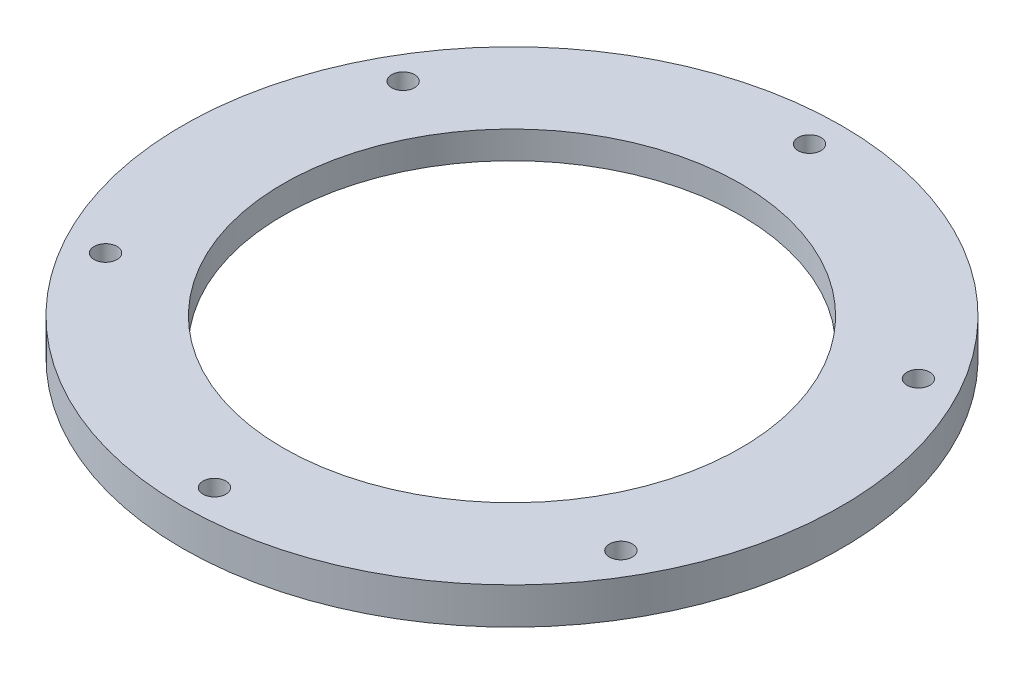
ISO-10303-21;
HEADER;
FILE_DESCRIPTION(('STEP AP214'),'2;1');
FILE_NAME('part.step','',(''),(''),'','','');
FILE_SCHEMA(('AUTOMOTIVE_DESIGN { 1 0 10303 214 1 1 1 1 }'));
ENDSEC;
DATA;
#1=APPLICATION_CONTEXT('core data for automotive mechanical design processes');
#2=APPLICATION_PROTOCOL_DEFINITION('international standard','automotive_design',2000,#1);
#3=PRODUCT_CONTEXT('',#1,'mechanical');
#4=PRODUCT('Part','Part','',(#3));
#5=PRODUCT_RELATED_PRODUCT_CATEGORY('part','',(#4));
#6=PRODUCT_DEFINITION_FORMATION('','',#4);
#7=PRODUCT_DEFINITION_CONTEXT('part definition',#1,'design');
#8=PRODUCT_DEFINITION('design','',#6,#7);
#9=PRODUCT_DEFINITION_SHAPE('','',#8);
#10=(LENGTH_UNIT() NAMED_UNIT(*) SI_UNIT(.MILLI.,.METRE.));
#11=(NAMED_UNIT(*) PLANE_ANGLE_UNIT() SI_UNIT($,.RADIAN.));
#12=(NAMED_UNIT(*) SI_UNIT($,.STERADIAN.) SOLID_ANGLE_UNIT());
#13=UNCERTAINTY_MEASURE_WITH_UNIT(LENGTH_MEASURE(1.E-05),#10,'distance_accuracy_value','');
#14=(GEOMETRIC_REPRESENTATION_CONTEXT(3) GLOBAL_UNCERTAINTY_ASSIGNED_CONTEXT((#13)) GLOBAL_UNIT_ASSIGNED_CONTEXT((#10,
#11,#12)) REPRESENTATION_CONTEXT('',''));
#15=CARTESIAN_POINT('',(0.,0.,0.));
#16=DIRECTION('',(0.,0.,1.));
#17=DIRECTION('',(1.,0.,0.));
#18=AXIS2_PLACEMENT_3D('',#15,#16,#17);
#19=CARTESIAN_POINT('',(0.,0.,0.));
#20=DIRECTION('',(0.,1.,0.));
#21=DIRECTION('',(0.,0.,1.));
#22=AXIS2_PLACEMENT_3D('',#19,#20,#21);
#23=PLANE('',#22);
#24=CARTESIAN_POINT('',(0.,0.,32.5));
#25=DIRECTION('',(0.,-1.,0.));
#26=DIRECTION('',(0.,0.,-1.));
#27=AXIS2_PLACEMENT_3D('',#24,#25,#26);
#28=CIRCLE('',#27,1.24999999999999);
#29=CARTESIAN_POINT('',(0.,0.,31.25));
#30=VERTEX_POINT('',#29);
#31=EDGE_CURVE('E92',#30,#30,#28,.T.);
#32=ORIENTED_EDGE('',*,*,#31,.F.);
#33=EDGE_LOOP('',(#32));
#34=FACE_BOUND('',#33,.T.);
#35=CARTESIAN_POINT('',(28.1458256229949,0.,16.2500000000012));
#36=DIRECTION('',(0.,-1.,0.));
#37=DIRECTION('',(0.,0.,-1.));
#38=AXIS2_PLACEMENT_3D('',#35,#36,#37);
#39=CIRCLE('',#38,1.24999999999999);
#40=CARTESIAN_POINT('',(28.1458256229949,0.,15.0000000000012));
#41=VERTEX_POINT('',#40);
#42=EDGE_CURVE('E86',#41,#41,#39,.T.);
#43=ORIENTED_EDGE('',*,*,#42,.F.);
#44=EDGE_LOOP('',(#43));
#45=FACE_BOUND('',#44,.T.);
#46=CARTESIAN_POINT('',(28.1458256229963,0.,-16.2499999999988));
#47=DIRECTION('',(0.,-1.,0.));
#48=DIRECTION('',(0.,0.,-1.));
#49=AXIS2_PLACEMENT_3D('',#46,#47,#48);
#50=CIRCLE('',#49,1.24999999999999);
#51=CARTESIAN_POINT('',(28.1458256229963,0.,-17.4999999999988));
#52=VERTEX_POINT('',#51);
#53=EDGE_CURVE('E80',#52,#52,#50,.T.);
#54=ORIENTED_EDGE('',*,*,#53,.F.);
#55=EDGE_LOOP('',(#54));
#56=FACE_BOUND('',#55,.T.);
#57=CARTESIAN_POINT('',(-28.1458256229936,0.,16.2499999999988));
#58=DIRECTION('',(0.,-1.,0.));
#59=DIRECTION('',(0.,0.,-1.));
#60=AXIS2_PLACEMENT_3D('',#57,#58,#59);
#61=CIRCLE('',#60,1.24999999999999);
#62=CARTESIAN_POINT('',(-28.1458256229936,0.,14.9999999999988));
#63=VERTEX_POINT('',#62);
#64=EDGE_CURVE('E74',#63,#63,#61,.T.);
#65=ORIENTED_EDGE('',*,*,#64,.F.);
#66=EDGE_LOOP('',(#65));
#67=FACE_BOUND('',#66,.T.);
#68=CARTESIAN_POINT('',(-28.1458256229922,0.,-16.2500000000012));
#69=DIRECTION('',(0.,-1.,0.));
#70=DIRECTION('',(0.,0.,-1.));
#71=AXIS2_PLACEMENT_3D('',#68,#69,#70);
#72=CIRCLE('',#71,1.24999999999999);
#73=CARTESIAN_POINT('',(-28.1458256229922,0.,-17.5000000000012));
#74=VERTEX_POINT('',#73);
#75=EDGE_CURVE('E68',#74,#74,#72,.T.);
#76=ORIENTED_EDGE('',*,*,#75,.F.);
#77=EDGE_LOOP('',(#76));
#78=FACE_BOUND('',#77,.T.);
#79=CARTESIAN_POINT('',(2.76315646526993E-12,0.,-32.5));
#80=DIRECTION('',(0.,-1.,0.));
#81=DIRECTION('',(0.,0.,-1.));
#82=AXIS2_PLACEMENT_3D('',#79,#80,#81);
#83=CIRCLE('',#82,1.24999999999999);
#84=CARTESIAN_POINT('',(2.76315646526993E-12,0.,-33.75));
#85=VERTEX_POINT('',#84);
#86=EDGE_CURVE('E62',#85,#85,#83,.T.);
#87=ORIENTED_EDGE('',*,*,#86,.F.);
#88=EDGE_LOOP('',(#87));
#89=FACE_BOUND('',#88,.T.);
#90=CARTESIAN_POINT('',(0.,0.,0.));
#91=DIRECTION('',(0.,1.,0.));
#92=DIRECTION('',(0.,0.,1.));
#93=AXIS2_PLACEMENT_3D('',#90,#91,#92);
#94=CIRCLE('',#93,25.);
#95=CARTESIAN_POINT('',(0.,0.,25.));
#96=VERTEX_POINT('',#95);
#97=EDGE_CURVE('E40',#96,#96,#94,.T.);
#98=ORIENTED_EDGE('',*,*,#97,.T.);
#99=EDGE_LOOP('',(#98));
#100=FACE_BOUND('',#99,.T.);
#101=CARTESIAN_POINT('',(0.,0.,0.));
#102=DIRECTION('',(0.,-1.,0.));
#103=DIRECTION('',(0.,0.,-1.));
#104=AXIS2_PLACEMENT_3D('',#101,#102,#103);
#105=CIRCLE('',#104,35.);
#106=CARTESIAN_POINT('',(0.,0.,-35.));
#107=VERTEX_POINT('',#106);
#108=EDGE_CURVE('E54',#107,#107,#105,.T.);
#109=ORIENTED_EDGE('',*,*,#108,.T.);
#110=EDGE_LOOP('',(#109));
#111=FACE_BOUND('',#110,.T.);
#112=ADVANCED_FACE('F36',(#34,#45,#56,#67,#78,#89,#100,#111),#23,.F.);
#113=CARTESIAN_POINT('',(0.,3.,0.));
#114=DIRECTION('',(0.,-1.,0.));
#115=DIRECTION('',(0.,0.,-1.));
#116=AXIS2_PLACEMENT_3D('',#113,#114,#115);
#117=CYLINDRICAL_SURFACE('',#116,25.);
#118=CARTESIAN_POINT('',(0.,3.,0.));
#119=DIRECTION('',(0.,1.,0.));
#120=DIRECTION('',(0.,0.,1.));
#121=AXIS2_PLACEMENT_3D('',#118,#119,#120);
#122=CIRCLE('',#121,25.);
#123=CARTESIAN_POINT('',(0.,3.,25.));
#124=VERTEX_POINT('',#123);
#125=EDGE_CURVE('E44',#124,#124,#122,.T.);
#126=ORIENTED_EDGE('',*,*,#125,.T.);
#127=EDGE_LOOP('',(#126));
#128=FACE_BOUND('',#127,.T.);
#129=ORIENTED_EDGE('',*,*,#97,.F.);
#130=EDGE_LOOP('',(#129));
#131=FACE_BOUND('',#130,.T.);
#132=ADVANCED_FACE('F38',(#128,#131),#117,.F.);
#133=CARTESIAN_POINT('',(0.,3.,0.));
#134=DIRECTION('',(0.,-1.,0.));
#135=DIRECTION('',(0.,0.,-1.));
#136=AXIS2_PLACEMENT_3D('',#133,#134,#135);
#137=CYLINDRICAL_SURFACE('',#136,36.);
#138=CARTESIAN_POINT('',(0.,3.,0.));
#139=DIRECTION('',(0.,1.,0.));
#140=DIRECTION('',(0.,0.,1.));
#141=AXIS2_PLACEMENT_3D('',#138,#139,#140);
#142=CIRCLE('',#141,36.);
#143=CARTESIAN_POINT('',(0.,3.,36.));
#144=VERTEX_POINT('',#143);
#145=EDGE_CURVE('E10',#144,#144,#142,.T.);
#146=ORIENTED_EDGE('',*,*,#145,.F.);
#147=EDGE_LOOP('',(#146));
#148=FACE_BOUND('',#147,.T.);
#149=CARTESIAN_POINT('',(0.,-1.,0.));
#150=DIRECTION('',(0.,-1.,0.));
#151=DIRECTION('',(0.,0.,-1.));
#152=AXIS2_PLACEMENT_3D('',#149,#150,#151);
#153=CIRCLE('',#152,36.);
#154=CARTESIAN_POINT('',(0.,-1.,-36.));
#155=VERTEX_POINT('',#154);
#156=EDGE_CURVE('E50',#155,#155,#153,.T.);
#157=ORIENTED_EDGE('',*,*,#156,.F.);
#158=EDGE_LOOP('',(#157));
#159=FACE_BOUND('',#158,.T.);
#160=ADVANCED_FACE('F135',(#148,#159),#137,.T.);
#161=CARTESIAN_POINT('',(0.,3.,0.));
#162=DIRECTION('',(0.,1.,0.));
#163=DIRECTION('',(0.,0.,1.));
#164=AXIS2_PLACEMENT_3D('',#161,#162,#163);
#165=PLANE('',#164);
#166=CARTESIAN_POINT('',(0.,3.,32.5));
#167=DIRECTION('',(0.,-1.,0.));
#168=DIRECTION('',(0.,0.,-1.));
#169=AXIS2_PLACEMENT_3D('',#166,#167,#168);
#170=CIRCLE('',#169,1.25);
#171=CARTESIAN_POINT('',(0.,3.,31.25));
#172=VERTEX_POINT('',#171);
#173=EDGE_CURVE('E89',#172,#172,#170,.T.);
#174=ORIENTED_EDGE('',*,*,#173,.T.);
#175=EDGE_LOOP('',(#174));
#176=FACE_BOUND('',#175,.T.);
#177=CARTESIAN_POINT('',(28.1458256229949,3.,16.2500000000012));
#178=DIRECTION('',(0.,-1.,0.));
#179=DIRECTION('',(0.,0.,-1.));
#180=AXIS2_PLACEMENT_3D('',#177,#178,#179);
#181=CIRCLE('',#180,1.25);
#182=CARTESIAN_POINT('',(28.1458256229949,3.,15.0000000000012));
#183=VERTEX_POINT('',#182);
#184=EDGE_CURVE('E83',#183,#183,#181,.T.);
#185=ORIENTED_EDGE('',*,*,#184,.T.);
#186=EDGE_LOOP('',(#185));
#187=FACE_BOUND('',#186,.T.);
#188=CARTESIAN_POINT('',(28.1458256229963,3.,-16.2499999999988));
#189=DIRECTION('',(0.,-1.,0.));
#190=DIRECTION('',(0.,0.,-1.));
#191=AXIS2_PLACEMENT_3D('',#188,#189,#190);
#192=CIRCLE('',#191,1.25);
#193=CARTESIAN_POINT('',(28.1458256229963,3.,-17.4999999999988));
#194=VERTEX_POINT('',#193);
#195=EDGE_CURVE('E77',#194,#194,#192,.T.);
#196=ORIENTED_EDGE('',*,*,#195,.T.);
#197=EDGE_LOOP('',(#196));
#198=FACE_BOUND('',#197,.T.);
#199=CARTESIAN_POINT('',(-28.1458256229936,3.,16.2499999999988));
#200=DIRECTION('',(0.,-1.,0.));
#201=DIRECTION('',(0.,0.,-1.));
#202=AXIS2_PLACEMENT_3D('',#199,#200,#201);
#203=CIRCLE('',#202,1.25);
#204=CARTESIAN_POINT('',(-28.1458256229936,3.,14.9999999999988));
#205=VERTEX_POINT('',#204);
#206=EDGE_CURVE('E71',#205,#205,#203,.T.);
#207=ORIENTED_EDGE('',*,*,#206,.T.);
#208=EDGE_LOOP('',(#207));
#209=FACE_BOUND('',#208,.T.);
#210=CARTESIAN_POINT('',(-28.1458256229922,3.,-16.2500000000012));
#211=DIRECTION('',(0.,-1.,0.));
#212=DIRECTION('',(0.,0.,-1.));
#213=AXIS2_PLACEMENT_3D('',#210,#211,#212);
#214=CIRCLE('',#213,1.25);
#215=CARTESIAN_POINT('',(-28.1458256229922,3.,-17.5000000000012));
#216=VERTEX_POINT('',#215);
#217=EDGE_CURVE('E65',#216,#216,#214,.T.);
#218=ORIENTED_EDGE('',*,*,#217,.T.);
#219=EDGE_LOOP('',(#218));
#220=FACE_BOUND('',#219,.T.);
#221=CARTESIAN_POINT('',(2.76315646526993E-12,3.,-32.5));
#222=DIRECTION('',(0.,-1.,0.));
#223=DIRECTION('',(0.,0.,-1.));
#224=AXIS2_PLACEMENT_3D('',#221,#222,#223);
#225=CIRCLE('',#224,1.25);
#226=CARTESIAN_POINT('',(2.76315646526993E-12,3.,-33.75));
#227=VERTEX_POINT('',#226);
#228=EDGE_CURVE('E57',#227,#227,#225,.T.);
#229=ORIENTED_EDGE('',*,*,#228,.T.);
#230=EDGE_LOOP('',(#229));
#231=FACE_BOUND('',#230,.T.);
#232=ORIENTED_EDGE('',*,*,#125,.F.);
#233=EDGE_LOOP('',(#232));
#234=FACE_BOUND('',#233,.T.);
#235=ORIENTED_EDGE('',*,*,#145,.T.);
#236=EDGE_LOOP('',(#235));
#237=FACE_BOUND('',#236,.T.);
#238=ADVANCED_FACE('F129',(#176,#187,#198,#209,#220,#231,#234,#237),#165,.T.);
#239=CARTESIAN_POINT('',(0.,-1.,0.));
#240=DIRECTION('',(0.,-1.,0.));
#241=DIRECTION('',(0.,0.,-1.));
#242=AXIS2_PLACEMENT_3D('',#239,#240,#241);
#243=PLANE('',#242);
#244=ORIENTED_EDGE('',*,*,#156,.T.);
#245=EDGE_LOOP('',(#244));
#246=FACE_BOUND('',#245,.T.);
#247=CARTESIAN_POINT('',(0.,-1.,0.));
#248=DIRECTION('',(0.,-1.,0.));
#249=DIRECTION('',(0.,0.,-1.));
#250=AXIS2_PLACEMENT_3D('',#247,#248,#249);
#251=CIRCLE('',#250,35.);
#252=CARTESIAN_POINT('',(0.,-1.,-35.));
#253=VERTEX_POINT('',#252);
#254=EDGE_CURVE('E53',#253,#253,#251,.T.);
#255=ORIENTED_EDGE('',*,*,#254,.F.);
#256=EDGE_LOOP('',(#255));
#257=FACE_BOUND('',#256,.T.);
#258=ADVANCED_FACE('F119',(#246,#257),#243,.T.);
#259=CARTESIAN_POINT('',(0.,-1.,0.));
#260=DIRECTION('',(0.,1.,0.));
#261=DIRECTION('',(0.,0.,1.));
#262=AXIS2_PLACEMENT_3D('',#259,#260,#261);
#263=CYLINDRICAL_SURFACE('',#262,35.);
#264=ORIENTED_EDGE('',*,*,#254,.T.);
#265=EDGE_LOOP('',(#264));
#266=FACE_BOUND('',#265,.T.);
#267=ORIENTED_EDGE('',*,*,#108,.F.);
#268=EDGE_LOOP('',(#267));
#269=FACE_BOUND('',#268,.T.);
#270=ADVANCED_FACE('F116',(#266,#269),#263,.F.);
#271=CARTESIAN_POINT('',(2.76315646526993E-12,0.,-32.5));
#272=DIRECTION('',(0.,-1.,0.));
#273=DIRECTION('',(0.,0.,-1.));
#274=AXIS2_PLACEMENT_3D('',#271,#272,#273);
#275=CYLINDRICAL_SURFACE('',#274,1.24999999999999);
#276=ORIENTED_EDGE('',*,*,#228,.F.);
#277=EDGE_LOOP('',(#276));
#278=FACE_BOUND('',#277,.T.);
#279=ORIENTED_EDGE('',*,*,#86,.T.);
#280=EDGE_LOOP('',(#279));
#281=FACE_BOUND('',#280,.T.);
#282=ADVANCED_FACE('F118',(#278,#281),#275,.F.);
#283=CARTESIAN_POINT('',(-28.1458256229922,0.,-16.2500000000012));
#284=DIRECTION('',(0.,-1.,0.));
#285=DIRECTION('',(0.,0.,-1.));
#286=AXIS2_PLACEMENT_3D('',#283,#284,#285);
#287=CYLINDRICAL_SURFACE('',#286,1.24999999999999);
#288=ORIENTED_EDGE('',*,*,#217,.F.);
#289=EDGE_LOOP('',(#288));
#290=FACE_BOUND('',#289,.T.);
#291=ORIENTED_EDGE('',*,*,#75,.T.);
#292=EDGE_LOOP('',(#291));
#293=FACE_BOUND('',#292,.T.);
#294=ADVANCED_FACE('F126',(#290,#293),#287,.F.);
#295=CARTESIAN_POINT('',(-28.1458256229936,0.,16.2499999999988));
#296=DIRECTION('',(0.,-1.,0.));
#297=DIRECTION('',(0.,0.,-1.));
#298=AXIS2_PLACEMENT_3D('',#295,#296,#297);
#299=CYLINDRICAL_SURFACE('',#298,1.24999999999999);
#300=ORIENTED_EDGE('',*,*,#206,.F.);
#301=EDGE_LOOP('',(#300));
#302=FACE_BOUND('',#301,.T.);
#303=ORIENTED_EDGE('',*,*,#64,.T.);
#304=EDGE_LOOP('',(#303));
#305=FACE_BOUND('',#304,.T.);
#306=ADVANCED_FACE('F185',(#302,#305),#299,.F.);
#307=CARTESIAN_POINT('',(28.1458256229963,0.,-16.2499999999988));
#308=DIRECTION('',(0.,-1.,0.));
#309=DIRECTION('',(0.,0.,-1.));
#310=AXIS2_PLACEMENT_3D('',#307,#308,#309);
#311=CYLINDRICAL_SURFACE('',#310,1.24999999999999);
#312=ORIENTED_EDGE('',*,*,#195,.F.);
#313=EDGE_LOOP('',(#312));
#314=FACE_BOUND('',#313,.T.);
#315=ORIENTED_EDGE('',*,*,#53,.T.);
#316=EDGE_LOOP('',(#315));
#317=FACE_BOUND('',#316,.T.);
#318=ADVANCED_FACE('F195',(#314,#317),#311,.F.);
#319=CARTESIAN_POINT('',(28.1458256229949,0.,16.2500000000012));
#320=DIRECTION('',(0.,-1.,0.));
#321=DIRECTION('',(0.,0.,-1.));
#322=AXIS2_PLACEMENT_3D('',#319,#320,#321);
#323=CYLINDRICAL_SURFACE('',#322,1.24999999999999);
#324=ORIENTED_EDGE('',*,*,#184,.F.);
#325=EDGE_LOOP('',(#324));
#326=FACE_BOUND('',#325,.T.);
#327=ORIENTED_EDGE('',*,*,#42,.T.);
#328=EDGE_LOOP('',(#327));
#329=FACE_BOUND('',#328,.T.);
#330=ADVANCED_FACE('F206',(#326,#329),#323,.F.);
#331=CARTESIAN_POINT('',(0.,0.,32.5));
#332=DIRECTION('',(0.,-1.,0.));
#333=DIRECTION('',(0.,0.,-1.));
#334=AXIS2_PLACEMENT_3D('',#331,#332,#333);
#335=CYLINDRICAL_SURFACE('',#334,1.24999999999999);
#336=ORIENTED_EDGE('',*,*,#173,.F.);
#337=EDGE_LOOP('',(#336));
#338=FACE_BOUND('',#337,.T.);
#339=ORIENTED_EDGE('',*,*,#31,.T.);
#340=EDGE_LOOP('',(#339));
#341=FACE_BOUND('',#340,.T.);
#342=ADVANCED_FACE('F96',(#338,#341),#335,.F.);
#343=CLOSED_SHELL('',(#112,#132,#160,#238,#258,#270,#282,#294,#306,#318,#330,#342));
#344=MANIFOLD_SOLID_BREP('B2',#343);
#345=ADVANCED_BREP_SHAPE_REPRESENTATION('',(#18,#344),#14);
#346=SHAPE_DEFINITION_REPRESENTATION(#9,#345);
ENDSEC;
END-ISO-10303-21;
